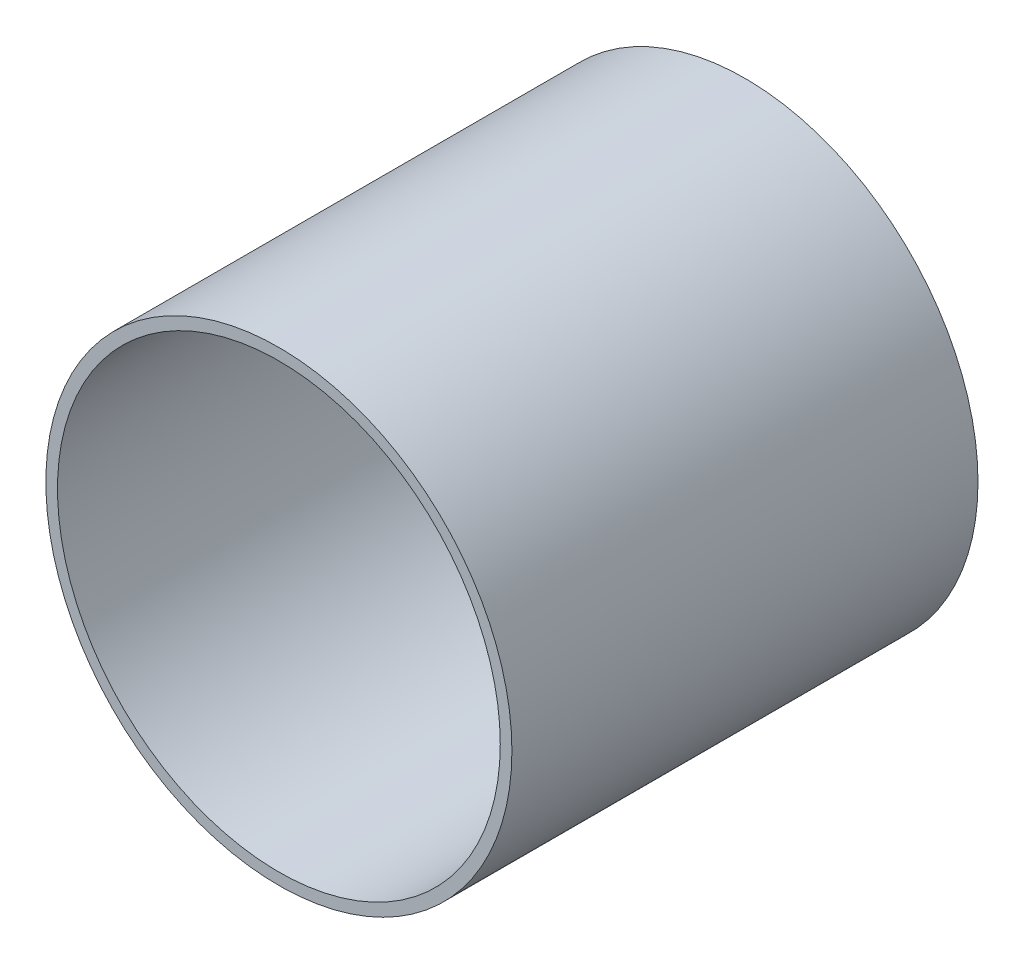
ISO-10303-21;
HEADER;
FILE_DESCRIPTION(('STEP AP214'),'2;1');
FILE_NAME('part.step','',(''),(''),'','','');
FILE_SCHEMA(('AUTOMOTIVE_DESIGN { 1 0 10303 214 1 1 1 1 }'));
ENDSEC;
DATA;
#1=APPLICATION_CONTEXT('core data for automotive mechanical design processes');
#2=APPLICATION_PROTOCOL_DEFINITION('international standard','automotive_design',2000,#1);
#3=PRODUCT_CONTEXT('',#1,'mechanical');
#4=PRODUCT('Part','Part','',(#3));
#5=PRODUCT_RELATED_PRODUCT_CATEGORY('part','',(#4));
#6=PRODUCT_DEFINITION_FORMATION('','',#4);
#7=PRODUCT_DEFINITION_CONTEXT('part definition',#1,'design');
#8=PRODUCT_DEFINITION('design','',#6,#7);
#9=PRODUCT_DEFINITION_SHAPE('','',#8);
#10=(LENGTH_UNIT() NAMED_UNIT(*) SI_UNIT(.MILLI.,.METRE.));
#11=(NAMED_UNIT(*) PLANE_ANGLE_UNIT() SI_UNIT($,.RADIAN.));
#12=(NAMED_UNIT(*) SI_UNIT($,.STERADIAN.) SOLID_ANGLE_UNIT());
#13=UNCERTAINTY_MEASURE_WITH_UNIT(LENGTH_MEASURE(1.E-05),#10,'distance_accuracy_value','');
#14=(GEOMETRIC_REPRESENTATION_CONTEXT(3) GLOBAL_UNCERTAINTY_ASSIGNED_CONTEXT((#13)) GLOBAL_UNIT_ASSIGNED_CONTEXT((#10,
#11,#12)) REPRESENTATION_CONTEXT('',''));
#15=CARTESIAN_POINT('',(0.,0.,0.));
#16=DIRECTION('',(0.,0.,1.));
#17=DIRECTION('',(1.,0.,0.));
#18=AXIS2_PLACEMENT_3D('',#15,#16,#17);
#19=CARTESIAN_POINT('',(0.,0.,30.));
#20=DIRECTION('',(0.,0.,-1.));
#21=DIRECTION('',(-1.,0.,0.));
#22=AXIS2_PLACEMENT_3D('',#19,#20,#21);
#23=CYLINDRICAL_SURFACE('',#22,80.);
#24=CARTESIAN_POINT('',(0.,0.,30.));
#25=DIRECTION('',(0.,0.,-1.));
#26=DIRECTION('',(-1.,0.,0.));
#27=AXIS2_PLACEMENT_3D('',#24,#25,#26);
#28=CIRCLE('',#27,80.);
#29=CARTESIAN_POINT('',(-80.,0.,30.));
#30=VERTEX_POINT('',#29);
#31=EDGE_CURVE('E11',#30,#30,#28,.T.);
#32=ORIENTED_EDGE('',*,*,#31,.T.);
#33=EDGE_LOOP('',(#32));
#34=FACE_BOUND('',#33,.T.);
#35=CARTESIAN_POINT('',(0.,0.,0.));
#36=DIRECTION('',(0.,0.,-1.));
#37=DIRECTION('',(-1.,0.,0.));
#38=AXIS2_PLACEMENT_3D('',#35,#36,#37);
#39=CIRCLE('',#38,80.);
#40=CARTESIAN_POINT('',(-80.,0.,0.));
#41=VERTEX_POINT('',#40);
#42=EDGE_CURVE('E51',#41,#41,#39,.T.);
#43=ORIENTED_EDGE('',*,*,#42,.F.);
#44=EDGE_LOOP('',(#43));
#45=FACE_BOUND('',#44,.T.);
#46=ADVANCED_FACE('F48',(#34,#45),#23,.T.);
#47=CARTESIAN_POINT('',(0.,0.,30.));
#48=DIRECTION('',(0.,0.,-1.));
#49=DIRECTION('',(-1.,0.,0.));
#50=AXIS2_PLACEMENT_3D('',#47,#48,#49);
#51=PLANE('',#50);
#52=ORIENTED_EDGE('',*,*,#31,.F.);
#53=EDGE_LOOP('',(#52));
#54=FACE_BOUND('',#53,.T.);
#55=ADVANCED_FACE('F63',(#54),#51,.F.);
#56=CARTESIAN_POINT('',(0.,0.,0.));
#57=DIRECTION('',(0.,0.,-1.));
#58=DIRECTION('',(-1.,0.,0.));
#59=AXIS2_PLACEMENT_3D('',#56,#57,#58);
#60=PLANE('',#59);
#61=ORIENTED_EDGE('',*,*,#42,.T.);
#62=EDGE_LOOP('',(#61));
#63=FACE_BOUND('',#62,.T.);
#64=ADVANCED_FACE('F60',(#63),#60,.T.);
#65=CLOSED_SHELL('',(#46,#55,#64));
#66=MANIFOLD_SOLID_BREP('B2',#65);
#67=CARTESIAN_POINT('',(0.,0.,200.));
#68=DIRECTION('',(0.,0.,-1.));
#69=DIRECTION('',(-1.,0.,0.));
#70=AXIS2_PLACEMENT_3D('',#67,#68,#69);
#71=CYLINDRICAL_SURFACE('',#70,100.);
#72=CARTESIAN_POINT('',(0.,0.,200.));
#73=DIRECTION('',(0.,0.,1.));
#74=DIRECTION('',(1.,0.,0.));
#75=AXIS2_PLACEMENT_3D('',#72,#73,#74);
#76=CIRCLE('',#75,100.);
#77=CARTESIAN_POINT('',(100.,0.,200.));
#78=VERTEX_POINT('',#77);
#79=EDGE_CURVE('E47',#78,#78,#76,.T.);
#80=ORIENTED_EDGE('',*,*,#79,.F.);
#81=EDGE_LOOP('',(#80));
#82=FACE_BOUND('',#81,.T.);
#83=CARTESIAN_POINT('',(0.,0.,0.));
#84=DIRECTION('',(0.,0.,1.));
#85=DIRECTION('',(1.,0.,0.));
#86=AXIS2_PLACEMENT_3D('',#83,#84,#85);
#87=CIRCLE('',#86,100.);
#88=CARTESIAN_POINT('',(100.,0.,0.));
#89=VERTEX_POINT('',#88);
#90=EDGE_CURVE('E101',#89,#89,#87,.T.);
#91=ORIENTED_EDGE('',*,*,#90,.T.);
#92=EDGE_LOOP('',(#91));
#93=FACE_BOUND('',#92,.T.);
#94=ADVANCED_FACE('F94',(#82,#93),#71,.T.);
#95=CARTESIAN_POINT('',(0.,0.,200.));
#96=DIRECTION('',(0.,0.,1.));
#97=DIRECTION('',(1.,0.,0.));
#98=AXIS2_PLACEMENT_3D('',#95,#96,#97);
#99=PLANE('',#98);
#100=CARTESIAN_POINT('',(0.,0.,200.));
#101=DIRECTION('',(0.,0.,1.));
#102=DIRECTION('',(1.,0.,0.));
#103=AXIS2_PLACEMENT_3D('',#100,#101,#102);
#104=CIRCLE('',#103,95.);
#105=CARTESIAN_POINT('',(95.,0.,200.));
#106=VERTEX_POINT('',#105);
#107=EDGE_CURVE('E107',#106,#106,#104,.T.);
#108=ORIENTED_EDGE('',*,*,#107,.F.);
#109=EDGE_LOOP('',(#108));
#110=FACE_BOUND('',#109,.T.);
#111=ORIENTED_EDGE('',*,*,#79,.T.);
#112=EDGE_LOOP('',(#111));
#113=FACE_BOUND('',#112,.T.);
#114=ADVANCED_FACE('F123',(#110,#113),#99,.T.);
#115=CARTESIAN_POINT('',(0.,0.,0.));
#116=DIRECTION('',(0.,0.,1.));
#117=DIRECTION('',(1.,0.,0.));
#118=AXIS2_PLACEMENT_3D('',#115,#116,#117);
#119=PLANE('',#118);
#120=CARTESIAN_POINT('',(0.,0.,0.));
#121=DIRECTION('',(0.,0.,1.));
#122=DIRECTION('',(1.,0.,0.));
#123=AXIS2_PLACEMENT_3D('',#120,#121,#122);
#124=CIRCLE('',#123,95.);
#125=CARTESIAN_POINT('',(95.,0.,0.));
#126=VERTEX_POINT('',#125);
#127=EDGE_CURVE('E97',#126,#126,#124,.T.);
#128=ORIENTED_EDGE('',*,*,#127,.T.);
#129=EDGE_LOOP('',(#128));
#130=FACE_BOUND('',#129,.T.);
#131=ORIENTED_EDGE('',*,*,#90,.F.);
#132=EDGE_LOOP('',(#131));
#133=FACE_BOUND('',#132,.T.);
#134=ADVANCED_FACE('F114',(#130,#133),#119,.F.);
#135=CARTESIAN_POINT('',(0.,0.,-200.));
#136=DIRECTION('',(0.,0.,1.));
#137=DIRECTION('',(1.,0.,0.));
#138=AXIS2_PLACEMENT_3D('',#135,#136,#137);
#139=CYLINDRICAL_SURFACE('',#138,95.);
#140=ORIENTED_EDGE('',*,*,#107,.T.);
#141=EDGE_LOOP('',(#140));
#142=FACE_BOUND('',#141,.T.);
#143=ORIENTED_EDGE('',*,*,#127,.F.);
#144=EDGE_LOOP('',(#143));
#145=FACE_BOUND('',#144,.T.);
#146=ADVANCED_FACE('F117',(#142,#145),#139,.F.);
#147=CLOSED_SHELL('',(#94,#114,#134,#146));
#148=MANIFOLD_SOLID_BREP('B6',#147);
#149=ADVANCED_BREP_SHAPE_REPRESENTATION('',(#18,#66,#148),#14);
#150=SHAPE_DEFINITION_REPRESENTATION(#9,#149);
ENDSEC;
END-ISO-10303-21;
